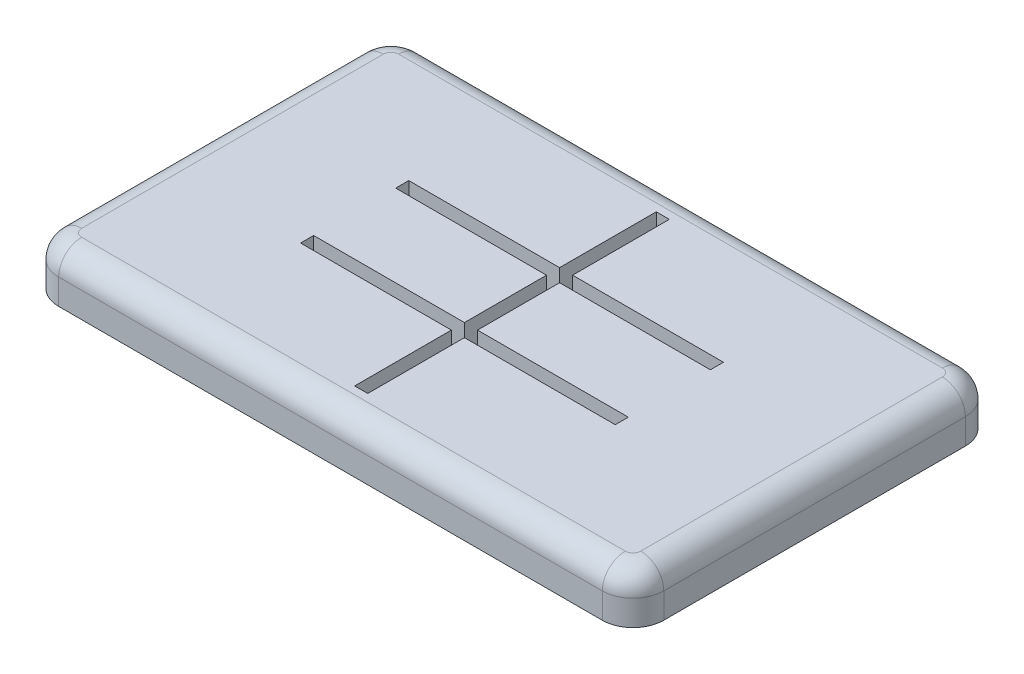
ISO-10303-21;
HEADER;
FILE_DESCRIPTION(('STEP AP214'),'2;1');
FILE_NAME('part.step','',(''),(''),'','','');
FILE_SCHEMA(('AUTOMOTIVE_DESIGN { 1 0 10303 214 1 1 1 1 }'));
ENDSEC;
DATA;
#1=APPLICATION_CONTEXT('core data for automotive mechanical design processes');
#2=APPLICATION_PROTOCOL_DEFINITION('international standard','automotive_design',2000,#1);
#3=PRODUCT_CONTEXT('',#1,'mechanical');
#4=PRODUCT('Part','Part','',(#3));
#5=PRODUCT_RELATED_PRODUCT_CATEGORY('part','',(#4));
#6=PRODUCT_DEFINITION_FORMATION('','',#4);
#7=PRODUCT_DEFINITION_CONTEXT('part definition',#1,'design');
#8=PRODUCT_DEFINITION('design','',#6,#7);
#9=PRODUCT_DEFINITION_SHAPE('','',#8);
#10=(LENGTH_UNIT() NAMED_UNIT(*) SI_UNIT(.MILLI.,.METRE.));
#11=(NAMED_UNIT(*) PLANE_ANGLE_UNIT() SI_UNIT($,.RADIAN.));
#12=(NAMED_UNIT(*) SI_UNIT($,.STERADIAN.) SOLID_ANGLE_UNIT());
#13=UNCERTAINTY_MEASURE_WITH_UNIT(LENGTH_MEASURE(1.E-05),#10,'distance_accuracy_value','');
#14=(GEOMETRIC_REPRESENTATION_CONTEXT(3) GLOBAL_UNCERTAINTY_ASSIGNED_CONTEXT((#13)) GLOBAL_UNIT_ASSIGNED_CONTEXT((#10,
#11,#12)) REPRESENTATION_CONTEXT('',''));
#15=CARTESIAN_POINT('',(0.,0.,0.));
#16=DIRECTION('',(0.,0.,1.));
#17=DIRECTION('',(1.,0.,0.));
#18=AXIS2_PLACEMENT_3D('',#15,#16,#17);
#19=CARTESIAN_POINT('',(0.,-20.,0.));
#20=DIRECTION('',(0.,1.,0.));
#21=DIRECTION('',(0.,0.,1.));
#22=AXIS2_PLACEMENT_3D('',#19,#20,#21);
#23=PLANE('',#22);
#24=DIRECTION('',(0.,0.,1.));
#25=VECTOR('',#24,1.);
#26=CARTESIAN_POINT('',(-125.,-20.,-75.));
#27=LINE('',#26,#25);
#28=CARTESIAN_POINT('',(-125.,-20.,-62.3));
#29=VERTEX_POINT('',#28);
#30=CARTESIAN_POINT('',(-125.,-20.,62.3));
#31=VERTEX_POINT('',#30);
#32=EDGE_CURVE('E396',#29,#31,#27,.T.);
#33=ORIENTED_EDGE('',*,*,#32,.F.);
#34=CARTESIAN_POINT('',(-112.3,-20.,-62.3));
#35=DIRECTION('',(0.,1.,0.));
#36=DIRECTION('',(0.,0.,1.));
#37=AXIS2_PLACEMENT_3D('',#34,#35,#36);
#38=CIRCLE('',#37,12.7);
#39=CARTESIAN_POINT('',(-112.3,-20.,-75.));
#40=VERTEX_POINT('',#39);
#41=EDGE_CURVE('E418',#29,#40,#38,.F.);
#42=ORIENTED_EDGE('',*,*,#41,.T.);
#43=DIRECTION('',(-1.,0.,0.));
#44=VECTOR('',#43,1.);
#45=CARTESIAN_POINT('',(-125.,-20.,-75.));
#46=LINE('',#45,#44);
#47=CARTESIAN_POINT('',(112.3,-20.,-75.));
#48=VERTEX_POINT('',#47);
#49=EDGE_CURVE('E392',#48,#40,#46,.T.);
#50=ORIENTED_EDGE('',*,*,#49,.F.);
#51=CARTESIAN_POINT('',(112.3,-20.,-62.3));
#52=DIRECTION('',(0.,1.,0.));
#53=DIRECTION('',(0.,0.,1.));
#54=AXIS2_PLACEMENT_3D('',#51,#52,#53);
#55=CIRCLE('',#54,12.7);
#56=CARTESIAN_POINT('',(125.,-20.,-62.3));
#57=VERTEX_POINT('',#56);
#58=EDGE_CURVE('E416',#48,#57,#55,.F.);
#59=ORIENTED_EDGE('',*,*,#58,.T.);
#60=DIRECTION('',(0.,0.,-1.));
#61=VECTOR('',#60,1.);
#62=CARTESIAN_POINT('',(125.,-20.,-75.));
#63=LINE('',#62,#61);
#64=CARTESIAN_POINT('',(125.,-20.,62.3));
#65=VERTEX_POINT('',#64);
#66=EDGE_CURVE('E389',#65,#57,#63,.T.);
#67=ORIENTED_EDGE('',*,*,#66,.F.);
#68=CARTESIAN_POINT('',(112.3,-20.,62.3));
#69=DIRECTION('',(0.,1.,0.));
#70=DIRECTION('',(0.,0.,1.));
#71=AXIS2_PLACEMENT_3D('',#68,#69,#70);
#72=CIRCLE('',#71,12.7);
#73=CARTESIAN_POINT('',(112.3,-20.,75.));
#74=VERTEX_POINT('',#73);
#75=EDGE_CURVE('E412',#65,#74,#72,.F.);
#76=ORIENTED_EDGE('',*,*,#75,.T.);
#77=DIRECTION('',(1.,0.,0.));
#78=VECTOR('',#77,1.);
#79=CARTESIAN_POINT('',(-125.,-20.,75.));
#80=LINE('',#79,#78);
#81=CARTESIAN_POINT('',(-112.3,-20.,75.));
#82=VERTEX_POINT('',#81);
#83=EDGE_CURVE('E399',#82,#74,#80,.T.);
#84=ORIENTED_EDGE('',*,*,#83,.F.);
#85=CARTESIAN_POINT('',(-112.3,-20.,62.3));
#86=DIRECTION('',(0.,1.,0.));
#87=DIRECTION('',(0.,0.,1.));
#88=AXIS2_PLACEMENT_3D('',#85,#86,#87);
#89=CIRCLE('',#88,12.7);
#90=EDGE_CURVE('E414',#82,#31,#89,.F.);
#91=ORIENTED_EDGE('',*,*,#90,.T.);
#92=EDGE_LOOP('',(#33,#42,#50,#59,#67,#76,#84,#91));
#93=FACE_BOUND('',#92,.T.);
#94=DIRECTION('',(1.,0.,0.));
#95=VECTOR('',#94,1.);
#96=CARTESIAN_POINT('',(-65.0000000000001,-20.,16.95));
#97=LINE('',#96,#95);
#98=CARTESIAN_POINT('',(-65.0000000000001,-20.,16.95));
#99=VERTEX_POINT('',#98);
#100=CARTESIAN_POINT('',(-2.7,-20.,16.9499999999999));
#101=VERTEX_POINT('',#100);
#102=EDGE_CURVE('E298',#99,#101,#97,.T.);
#103=ORIENTED_EDGE('',*,*,#102,.F.);
#104=DIRECTION('',(0.,0.,1.));
#105=VECTOR('',#104,1.);
#106=CARTESIAN_POINT('',(-65.0000000000001,-20.,16.95));
#107=LINE('',#106,#105);
#108=CARTESIAN_POINT('',(-65.0000000000001,-20.,22.35));
#109=VERTEX_POINT('',#108);
#110=EDGE_CURVE('E320',#99,#109,#107,.T.);
#111=ORIENTED_EDGE('',*,*,#110,.T.);
#112=DIRECTION('',(1.,0.,0.));
#113=VECTOR('',#112,1.);
#114=CARTESIAN_POINT('',(-65.0000000000001,-20.,22.35));
#115=LINE('',#114,#113);
#116=CARTESIAN_POINT('',(-2.7,-20.,22.35));
#117=VERTEX_POINT('',#116);
#118=EDGE_CURVE('E309',#109,#117,#115,.T.);
#119=ORIENTED_EDGE('',*,*,#118,.T.);
#120=DIRECTION('',(0.,0.,1.));
#121=VECTOR('',#120,1.);
#122=CARTESIAN_POINT('',(-2.7,-20.,-62.3));
#123=LINE('',#122,#121);
#124=CARTESIAN_POINT('',(-2.7,-20.,61.3000000000001));
#125=VERTEX_POINT('',#124);
#126=EDGE_CURVE('E328',#117,#125,#123,.T.);
#127=ORIENTED_EDGE('',*,*,#126,.T.);
#128=DIRECTION('',(1.,0.,0.));
#129=VECTOR('',#128,1.);
#130=CARTESIAN_POINT('',(-2.7,-20.,61.3000000000001));
#131=LINE('',#130,#129);
#132=CARTESIAN_POINT('',(2.7,-20.,61.3000000000001));
#133=VERTEX_POINT('',#132);
#134=EDGE_CURVE('E369',#133,#125,#131,.F.);
#135=ORIENTED_EDGE('',*,*,#134,.F.);
#136=DIRECTION('',(0.,0.,1.));
#137=VECTOR('',#136,1.);
#138=CARTESIAN_POINT('',(2.7,-20.,-62.3));
#139=LINE('',#138,#137);
#140=CARTESIAN_POINT('',(2.7,-20.,22.35));
#141=VERTEX_POINT('',#140);
#142=EDGE_CURVE('E351',#141,#133,#139,.T.);
#143=ORIENTED_EDGE('',*,*,#142,.F.);
#144=CARTESIAN_POINT('',(65.0000000000001,-20.,22.35));
#145=VERTEX_POINT('',#144);
#146=EDGE_CURVE('E308',#141,#145,#115,.T.);
#147=ORIENTED_EDGE('',*,*,#146,.T.);
#148=DIRECTION('',(0.,0.,1.));
#149=VECTOR('',#148,1.);
#150=CARTESIAN_POINT('',(65.0000000000001,-20.,16.95));
#151=LINE('',#150,#149);
#152=CARTESIAN_POINT('',(65.0000000000001,-20.,16.95));
#153=VERTEX_POINT('',#152);
#154=EDGE_CURVE('E318',#153,#145,#151,.T.);
#155=ORIENTED_EDGE('',*,*,#154,.F.);
#156=CARTESIAN_POINT('',(2.7,-20.,16.9499999999999));
#157=VERTEX_POINT('',#156);
#158=EDGE_CURVE('E296',#157,#153,#97,.T.);
#159=ORIENTED_EDGE('',*,*,#158,.F.);
#160=CARTESIAN_POINT('',(2.7,-20.,-16.95));
#161=VERTEX_POINT('',#160);
#162=EDGE_CURVE('E356',#161,#157,#139,.T.);
#163=ORIENTED_EDGE('',*,*,#162,.F.);
#164=DIRECTION('',(1.,0.,0.));
#165=VECTOR('',#164,1.);
#166=CARTESIAN_POINT('',(-65.0000000000001,-20.,-16.95));
#167=LINE('',#166,#165);
#168=CARTESIAN_POINT('',(65.0000000000001,-20.,-16.95));
#169=VERTEX_POINT('',#168);
#170=EDGE_CURVE('E942',#161,#169,#167,.T.);
#171=ORIENTED_EDGE('',*,*,#170,.T.);
#172=DIRECTION('',(0.,0.,1.));
#173=VECTOR('',#172,1.);
#174=CARTESIAN_POINT('',(65.0000000000001,-20.,-22.35));
#175=LINE('',#174,#173);
#176=CARTESIAN_POINT('',(65.0000000000001,-20.,-22.35));
#177=VERTEX_POINT('',#176);
#178=EDGE_CURVE('E286',#177,#169,#175,.T.);
#179=ORIENTED_EDGE('',*,*,#178,.F.);
#180=DIRECTION('',(1.,0.,0.));
#181=VECTOR('',#180,1.);
#182=CARTESIAN_POINT('',(-65.0000000000001,-20.,-22.35));
#183=LINE('',#182,#181);
#184=CARTESIAN_POINT('',(2.7,-20.,-22.35));
#185=VERTEX_POINT('',#184);
#186=EDGE_CURVE('E276',#185,#177,#183,.T.);
#187=ORIENTED_EDGE('',*,*,#186,.F.);
#188=CARTESIAN_POINT('',(2.7,-20.,-61.3));
#189=VERTEX_POINT('',#188);
#190=EDGE_CURVE('E352',#189,#185,#139,.T.);
#191=ORIENTED_EDGE('',*,*,#190,.F.);
#192=DIRECTION('',(1.,0.,0.));
#193=VECTOR('',#192,1.);
#194=CARTESIAN_POINT('',(-2.7,-20.,-61.3));
#195=LINE('',#194,#193);
#196=CARTESIAN_POINT('',(-2.7,-20.,-61.3));
#197=VERTEX_POINT('',#196);
#198=EDGE_CURVE('E371',#197,#189,#195,.T.);
#199=ORIENTED_EDGE('',*,*,#198,.F.);
#200=CARTESIAN_POINT('',(-2.7,-20.,-22.35));
#201=VERTEX_POINT('',#200);
#202=EDGE_CURVE('E329',#197,#201,#123,.T.);
#203=ORIENTED_EDGE('',*,*,#202,.T.);
#204=CARTESIAN_POINT('',(-65.0000000000001,-20.,-22.35));
#205=VERTEX_POINT('',#204);
#206=EDGE_CURVE('E289',#205,#201,#183,.T.);
#207=ORIENTED_EDGE('',*,*,#206,.F.);
#208=DIRECTION('',(0.,0.,1.));
#209=VECTOR('',#208,1.);
#210=CARTESIAN_POINT('',(-65.0000000000001,-20.,-22.35));
#211=LINE('',#210,#209);
#212=CARTESIAN_POINT('',(-65.0000000000001,-20.,-16.95));
#213=VERTEX_POINT('',#212);
#214=EDGE_CURVE('E275',#205,#213,#211,.T.);
#215=ORIENTED_EDGE('',*,*,#214,.T.);
#216=CARTESIAN_POINT('',(-2.7,-20.,-16.95));
#217=VERTEX_POINT('',#216);
#218=EDGE_CURVE('E528',#213,#217,#167,.T.);
#219=ORIENTED_EDGE('',*,*,#218,.T.);
#220=EDGE_CURVE('E333',#217,#101,#123,.T.);
#221=ORIENTED_EDGE('',*,*,#220,.T.);
#222=EDGE_LOOP('',(#103,#111,#119,#127,#135,#143,#147,#155,#159,#163,#171,#179,#187,#191,#199,
#203,#207,#215,#219,#221));
#223=FACE_BOUND('',#222,.T.);
#224=ADVANCED_FACE('F35',(#93,#223),#23,.F.);
#225=CARTESIAN_POINT('',(125.,-20.,-75.));
#226=DIRECTION('',(1.,0.,0.));
#227=DIRECTION('',(0.,0.,-1.));
#228=AXIS2_PLACEMENT_3D('',#225,#226,#227);
#229=PLANE('',#228);
#230=DIRECTION('',(0.,1.,0.));
#231=VECTOR('',#230,1.);
#232=CARTESIAN_POINT('',(125.,-20.,-62.3));
#233=LINE('',#232,#231);
#234=CARTESIAN_POINT('',(125.,-9.5,-62.3));
#235=VERTEX_POINT('',#234);
#236=EDGE_CURVE('E422',#57,#235,#233,.T.);
#237=ORIENTED_EDGE('',*,*,#236,.T.);
#238=DIRECTION('',(0.,0.,-1.));
#239=VECTOR('',#238,1.);
#240=CARTESIAN_POINT('',(125.,-9.5,-75.));
#241=LINE('',#240,#239);
#242=CARTESIAN_POINT('',(125.,-9.5,62.3));
#243=VERTEX_POINT('',#242);
#244=EDGE_CURVE('E458',#235,#243,#241,.F.);
#245=ORIENTED_EDGE('',*,*,#244,.T.);
#246=DIRECTION('',(0.,1.,0.));
#247=VECTOR('',#246,1.);
#248=CARTESIAN_POINT('',(125.,-20.,62.3));
#249=LINE('',#248,#247);
#250=EDGE_CURVE('E420',#243,#65,#249,.F.);
#251=ORIENTED_EDGE('',*,*,#250,.T.);
#252=ORIENTED_EDGE('',*,*,#66,.T.);
#253=EDGE_LOOP('',(#237,#245,#251,#252));
#254=FACE_BOUND('',#253,.T.);
#255=ADVANCED_FACE('F554',(#254),#229,.T.);
#256=CARTESIAN_POINT('',(-125.,-20.,75.));
#257=DIRECTION('',(0.,0.,1.));
#258=DIRECTION('',(1.,0.,0.));
#259=AXIS2_PLACEMENT_3D('',#256,#257,#258);
#260=PLANE('',#259);
#261=DIRECTION('',(0.,1.,0.));
#262=VECTOR('',#261,1.);
#263=CARTESIAN_POINT('',(112.3,-20.,75.));
#264=LINE('',#263,#262);
#265=CARTESIAN_POINT('',(112.3,-9.5,75.));
#266=VERTEX_POINT('',#265);
#267=EDGE_CURVE('E425',#74,#266,#264,.T.);
#268=ORIENTED_EDGE('',*,*,#267,.T.);
#269=DIRECTION('',(1.,0.,0.));
#270=VECTOR('',#269,1.);
#271=CARTESIAN_POINT('',(-125.,-9.5,75.));
#272=LINE('',#271,#270);
#273=CARTESIAN_POINT('',(-112.3,-9.5,75.));
#274=VERTEX_POINT('',#273);
#275=EDGE_CURVE('E462',#266,#274,#272,.F.);
#276=ORIENTED_EDGE('',*,*,#275,.T.);
#277=DIRECTION('',(0.,1.,0.));
#278=VECTOR('',#277,1.);
#279=CARTESIAN_POINT('',(-112.3,-20.,75.));
#280=LINE('',#279,#278);
#281=EDGE_CURVE('E428',#274,#82,#280,.F.);
#282=ORIENTED_EDGE('',*,*,#281,.T.);
#283=ORIENTED_EDGE('',*,*,#83,.T.);
#284=EDGE_LOOP('',(#268,#276,#282,#283));
#285=FACE_BOUND('',#284,.T.);
#286=ADVANCED_FACE('F560',(#285),#260,.T.);
#287=CARTESIAN_POINT('',(-125.,-20.,-75.));
#288=DIRECTION('',(-1.,0.,0.));
#289=DIRECTION('',(0.,0.,1.));
#290=AXIS2_PLACEMENT_3D('',#287,#288,#289);
#291=PLANE('',#290);
#292=DIRECTION('',(0.,1.,0.));
#293=VECTOR('',#292,1.);
#294=CARTESIAN_POINT('',(-125.,-20.,62.3));
#295=LINE('',#294,#293);
#296=CARTESIAN_POINT('',(-125.,-9.5,62.3));
#297=VERTEX_POINT('',#296);
#298=EDGE_CURVE('E407',#31,#297,#295,.T.);
#299=ORIENTED_EDGE('',*,*,#298,.T.);
#300=DIRECTION('',(0.,0.,1.));
#301=VECTOR('',#300,1.);
#302=CARTESIAN_POINT('',(-125.,-9.5,-75.));
#303=LINE('',#302,#301);
#304=CARTESIAN_POINT('',(-125.,-9.5,-62.3));
#305=VERTEX_POINT('',#304);
#306=EDGE_CURVE('E450',#297,#305,#303,.F.);
#307=ORIENTED_EDGE('',*,*,#306,.T.);
#308=DIRECTION('',(0.,1.,0.));
#309=VECTOR('',#308,1.);
#310=CARTESIAN_POINT('',(-125.,-20.,-62.3));
#311=LINE('',#310,#309);
#312=EDGE_CURVE('E410',#305,#29,#311,.F.);
#313=ORIENTED_EDGE('',*,*,#312,.T.);
#314=ORIENTED_EDGE('',*,*,#32,.T.);
#315=EDGE_LOOP('',(#299,#307,#313,#314));
#316=FACE_BOUND('',#315,.T.);
#317=ADVANCED_FACE('F573',(#316),#291,.T.);
#318=CARTESIAN_POINT('',(-125.,-20.,-75.));
#319=DIRECTION('',(0.,0.,-1.));
#320=DIRECTION('',(-1.,0.,0.));
#321=AXIS2_PLACEMENT_3D('',#318,#319,#320);
#322=PLANE('',#321);
#323=DIRECTION('',(0.,1.,0.));
#324=VECTOR('',#323,1.);
#325=CARTESIAN_POINT('',(-112.3,-20.,-75.));
#326=LINE('',#325,#324);
#327=CARTESIAN_POINT('',(-112.3,-9.5,-75.));
#328=VERTEX_POINT('',#327);
#329=EDGE_CURVE('E404',#40,#328,#326,.T.);
#330=ORIENTED_EDGE('',*,*,#329,.T.);
#331=DIRECTION('',(-1.,0.,0.));
#332=VECTOR('',#331,1.);
#333=CARTESIAN_POINT('',(-125.,-9.5,-75.));
#334=LINE('',#333,#332);
#335=CARTESIAN_POINT('',(112.3,-9.5,-75.));
#336=VERTEX_POINT('',#335);
#337=EDGE_CURVE('E454',#328,#336,#334,.F.);
#338=ORIENTED_EDGE('',*,*,#337,.T.);
#339=DIRECTION('',(0.,1.,0.));
#340=VECTOR('',#339,1.);
#341=CARTESIAN_POINT('',(112.3,-20.,-75.));
#342=LINE('',#341,#340);
#343=EDGE_CURVE('E402',#336,#48,#342,.F.);
#344=ORIENTED_EDGE('',*,*,#343,.T.);
#345=ORIENTED_EDGE('',*,*,#49,.T.);
#346=EDGE_LOOP('',(#330,#338,#344,#345));
#347=FACE_BOUND('',#346,.T.);
#348=ADVANCED_FACE('F570',(#347),#322,.T.);
#349=CARTESIAN_POINT('',(0.,0.,0.));
#350=DIRECTION('',(0.,1.,0.));
#351=DIRECTION('',(0.,0.,1.));
#352=AXIS2_PLACEMENT_3D('',#349,#350,#351);
#353=PLANE('',#352);
#354=DIRECTION('',(0.,0.,1.));
#355=VECTOR('',#354,1.);
#356=CARTESIAN_POINT('',(-2.7,0.,0.));
#357=LINE('',#356,#355);
#358=CARTESIAN_POINT('',(-2.7,1.11022302462516E-13,22.35));
#359=VERTEX_POINT('',#358);
#360=CARTESIAN_POINT('',(-2.7,0.,62.3000000000001));
#361=VERTEX_POINT('',#360);
#362=EDGE_CURVE('E11',#359,#361,#357,.T.);
#363=ORIENTED_EDGE('',*,*,#362,.F.);
#364=DIRECTION('',(1.,0.,0.));
#365=VECTOR('',#364,1.);
#366=CARTESIAN_POINT('',(0.,0.,22.35));
#367=LINE('',#366,#365);
#368=CARTESIAN_POINT('',(-65.0000000000001,0.,22.35));
#369=VERTEX_POINT('',#368);
#370=EDGE_CURVE('E43',#369,#359,#367,.T.);
#371=ORIENTED_EDGE('',*,*,#370,.F.);
#372=DIRECTION('',(0.,0.,1.));
#373=VECTOR('',#372,1.);
#374=CARTESIAN_POINT('',(-65.0000000000001,0.,16.95));
#375=LINE('',#374,#373);
#376=CARTESIAN_POINT('',(-65.0000000000001,0.,16.95));
#377=VERTEX_POINT('',#376);
#378=EDGE_CURVE('E304',#377,#369,#375,.T.);
#379=ORIENTED_EDGE('',*,*,#378,.F.);
#380=DIRECTION('',(1.,0.,0.));
#381=VECTOR('',#380,1.);
#382=CARTESIAN_POINT('',(0.,0.,16.95));
#383=LINE('',#382,#381);
#384=CARTESIAN_POINT('',(-2.7,0.,16.95));
#385=VERTEX_POINT('',#384);
#386=EDGE_CURVE('E492',#377,#385,#383,.T.);
#387=ORIENTED_EDGE('',*,*,#386,.T.);
#388=DIRECTION('',(0.,0.,1.));
#389=VECTOR('',#388,1.);
#390=CARTESIAN_POINT('',(-2.7,0.,0.));
#391=LINE('',#390,#389);
#392=CARTESIAN_POINT('',(-2.7,0.,-16.9499999999999));
#393=VERTEX_POINT('',#392);
#394=EDGE_CURVE('E493',#393,#385,#391,.T.);
#395=ORIENTED_EDGE('',*,*,#394,.F.);
#396=DIRECTION('',(1.,0.,0.));
#397=VECTOR('',#396,1.);
#398=CARTESIAN_POINT('',(0.,0.,-16.95));
#399=LINE('',#398,#397);
#400=CARTESIAN_POINT('',(-65.0000000000001,0.,-16.95));
#401=VERTEX_POINT('',#400);
#402=EDGE_CURVE('E283',#401,#393,#399,.T.);
#403=ORIENTED_EDGE('',*,*,#402,.F.);
#404=DIRECTION('',(0.,0.,1.));
#405=VECTOR('',#404,1.);
#406=CARTESIAN_POINT('',(-65.0000000000001,0.,-22.35));
#407=LINE('',#406,#405);
#408=CARTESIAN_POINT('',(-65.0000000000001,0.,-22.35));
#409=VERTEX_POINT('',#408);
#410=EDGE_CURVE('E272',#409,#401,#407,.T.);
#411=ORIENTED_EDGE('',*,*,#410,.F.);
#412=DIRECTION('',(1.,0.,0.));
#413=VECTOR('',#412,1.);
#414=CARTESIAN_POINT('',(0.,0.,-22.35));
#415=LINE('',#414,#413);
#416=CARTESIAN_POINT('',(-2.7,1.11022302462516E-13,-22.3499999999999));
#417=VERTEX_POINT('',#416);
#418=EDGE_CURVE('E255',#409,#417,#415,.T.);
#419=ORIENTED_EDGE('',*,*,#418,.T.);
#420=DIRECTION('',(0.,0.,1.));
#421=VECTOR('',#420,1.);
#422=CARTESIAN_POINT('',(-2.7,0.,0.));
#423=LINE('',#422,#421);
#424=CARTESIAN_POINT('',(-2.7,0.,-62.3));
#425=VERTEX_POINT('',#424);
#426=EDGE_CURVE('E265',#425,#417,#423,.T.);
#427=ORIENTED_EDGE('',*,*,#426,.F.);
#428=DIRECTION('',(1.,0.,0.));
#429=VECTOR('',#428,1.);
#430=CARTESIAN_POINT('',(-2.7,0.,-62.3));
#431=LINE('',#430,#429);
#432=CARTESIAN_POINT('',(2.7,0.,-62.3));
#433=VERTEX_POINT('',#432);
#434=EDGE_CURVE('E366',#425,#433,#431,.T.);
#435=ORIENTED_EDGE('',*,*,#434,.T.);
#436=DIRECTION('',(0.,0.,1.));
#437=VECTOR('',#436,1.);
#438=CARTESIAN_POINT('',(2.7,0.,0.));
#439=LINE('',#438,#437);
#440=CARTESIAN_POINT('',(2.7,1.11022302462516E-13,-22.3499999999999));
#441=VERTEX_POINT('',#440);
#442=EDGE_CURVE('E266',#433,#441,#439,.T.);
#443=ORIENTED_EDGE('',*,*,#442,.T.);
#444=CARTESIAN_POINT('',(65.0000000000001,0.,-22.35));
#445=VERTEX_POINT('',#444);
#446=EDGE_CURVE('E268',#441,#445,#415,.T.);
#447=ORIENTED_EDGE('',*,*,#446,.T.);
#448=DIRECTION('',(0.,0.,1.));
#449=VECTOR('',#448,1.);
#450=CARTESIAN_POINT('',(65.0000000000001,0.,-22.35));
#451=LINE('',#450,#449);
#452=CARTESIAN_POINT('',(65.0000000000001,0.,-16.95));
#453=VERTEX_POINT('',#452);
#454=EDGE_CURVE('E348',#445,#453,#451,.T.);
#455=ORIENTED_EDGE('',*,*,#454,.T.);
#456=CARTESIAN_POINT('',(2.7,0.,-16.95));
#457=VERTEX_POINT('',#456);
#458=EDGE_CURVE('E464',#457,#453,#399,.T.);
#459=ORIENTED_EDGE('',*,*,#458,.F.);
#460=DIRECTION('',(0.,0.,1.));
#461=VECTOR('',#460,1.);
#462=CARTESIAN_POINT('',(2.7,0.,0.));
#463=LINE('',#462,#461);
#464=CARTESIAN_POINT('',(2.7,0.,16.95));
#465=VERTEX_POINT('',#464);
#466=EDGE_CURVE('E486',#457,#465,#463,.T.);
#467=ORIENTED_EDGE('',*,*,#466,.T.);
#468=CARTESIAN_POINT('',(65.0000000000001,0.,16.95));
#469=VERTEX_POINT('',#468);
#470=EDGE_CURVE('E489',#465,#469,#383,.T.);
#471=ORIENTED_EDGE('',*,*,#470,.T.);
#472=DIRECTION('',(0.,0.,1.));
#473=VECTOR('',#472,1.);
#474=CARTESIAN_POINT('',(65.0000000000001,0.,16.95));
#475=LINE('',#474,#473);
#476=CARTESIAN_POINT('',(65.0000000000001,0.,22.35));
#477=VERTEX_POINT('',#476);
#478=EDGE_CURVE('E314',#469,#477,#475,.T.);
#479=ORIENTED_EDGE('',*,*,#478,.T.);
#480=CARTESIAN_POINT('',(2.7,1.11022302462516E-13,22.35));
#481=VERTEX_POINT('',#480);
#482=EDGE_CURVE('E499',#481,#477,#367,.T.);
#483=ORIENTED_EDGE('',*,*,#482,.F.);
#484=DIRECTION('',(0.,0.,1.));
#485=VECTOR('',#484,1.);
#486=CARTESIAN_POINT('',(2.7,0.,0.));
#487=LINE('',#486,#485);
#488=CARTESIAN_POINT('',(2.7,0.,62.3000000000001));
#489=VERTEX_POINT('',#488);
#490=EDGE_CURVE('E500',#481,#489,#487,.T.);
#491=ORIENTED_EDGE('',*,*,#490,.T.);
#492=DIRECTION('',(1.,0.,0.));
#493=VECTOR('',#492,1.);
#494=CARTESIAN_POINT('',(-2.7,0.,62.3000000000001));
#495=LINE('',#494,#493);
#496=EDGE_CURVE('E343',#361,#489,#495,.T.);
#497=ORIENTED_EDGE('',*,*,#496,.F.);
#498=EDGE_LOOP('',(#363,#371,#379,#387,#395,#403,#411,#419,#427,#435,#443,#447,#455,#459,#467,
#471,#479,#483,#491,#497));
#499=FACE_BOUND('',#498,.T.);
#500=DIRECTION('',(0.,0.,1.));
#501=VECTOR('',#500,1.);
#502=CARTESIAN_POINT('',(-115.5,0.,0.));
#503=LINE('',#502,#501);
#504=CARTESIAN_POINT('',(-115.5,0.,-62.3));
#505=VERTEX_POINT('',#504);
#506=CARTESIAN_POINT('',(-115.5,0.,62.3));
#507=VERTEX_POINT('',#506);
#508=EDGE_CURVE('E442',#505,#507,#503,.T.);
#509=ORIENTED_EDGE('',*,*,#508,.T.);
#510=CARTESIAN_POINT('',(-112.3,0.,62.3));
#511=DIRECTION('',(0.,1.,0.));
#512=DIRECTION('',(0.,0.,1.));
#513=AXIS2_PLACEMENT_3D('',#510,#511,#512);
#514=CIRCLE('',#513,3.2);
#515=CARTESIAN_POINT('',(-112.3,0.,65.5));
#516=VERTEX_POINT('',#515);
#517=EDGE_CURVE('E444',#507,#516,#514,.T.);
#518=ORIENTED_EDGE('',*,*,#517,.T.);
#519=DIRECTION('',(1.,0.,0.));
#520=VECTOR('',#519,1.);
#521=CARTESIAN_POINT('',(0.,0.,65.5));
#522=LINE('',#521,#520);
#523=CARTESIAN_POINT('',(112.3,0.,65.5));
#524=VERTEX_POINT('',#523);
#525=EDGE_CURVE('E430',#516,#524,#522,.T.);
#526=ORIENTED_EDGE('',*,*,#525,.T.);
#527=CARTESIAN_POINT('',(112.3,0.,62.3));
#528=DIRECTION('',(0.,1.,0.));
#529=DIRECTION('',(0.,0.,1.));
#530=AXIS2_PLACEMENT_3D('',#527,#528,#529);
#531=CIRCLE('',#530,3.2);
#532=CARTESIAN_POINT('',(115.5,0.,62.3));
#533=VERTEX_POINT('',#532);
#534=EDGE_CURVE('E432',#524,#533,#531,.T.);
#535=ORIENTED_EDGE('',*,*,#534,.T.);
#536=DIRECTION('',(0.,0.,-1.));
#537=VECTOR('',#536,1.);
#538=CARTESIAN_POINT('',(115.5,0.,0.));
#539=LINE('',#538,#537);
#540=CARTESIAN_POINT('',(115.5,0.,-62.3));
#541=VERTEX_POINT('',#540);
#542=EDGE_CURVE('E434',#533,#541,#539,.T.);
#543=ORIENTED_EDGE('',*,*,#542,.T.);
#544=CARTESIAN_POINT('',(112.3,0.,-62.3));
#545=DIRECTION('',(0.,1.,0.));
#546=DIRECTION('',(0.,0.,1.));
#547=AXIS2_PLACEMENT_3D('',#544,#545,#546);
#548=CIRCLE('',#547,3.2);
#549=CARTESIAN_POINT('',(112.3,0.,-65.5));
#550=VERTEX_POINT('',#549);
#551=EDGE_CURVE('E436',#541,#550,#548,.T.);
#552=ORIENTED_EDGE('',*,*,#551,.T.);
#553=DIRECTION('',(-1.,0.,0.));
#554=VECTOR('',#553,1.);
#555=CARTESIAN_POINT('',(0.,0.,-65.5));
#556=LINE('',#555,#554);
#557=CARTESIAN_POINT('',(-112.3,0.,-65.5));
#558=VERTEX_POINT('',#557);
#559=EDGE_CURVE('E438',#550,#558,#556,.T.);
#560=ORIENTED_EDGE('',*,*,#559,.T.);
#561=CARTESIAN_POINT('',(-112.3,0.,-62.3));
#562=DIRECTION('',(0.,1.,0.));
#563=DIRECTION('',(0.,0.,1.));
#564=AXIS2_PLACEMENT_3D('',#561,#562,#563);
#565=CIRCLE('',#564,3.2);
#566=EDGE_CURVE('E440',#558,#505,#565,.T.);
#567=ORIENTED_EDGE('',*,*,#566,.T.);
#568=EDGE_LOOP('',(#509,#518,#526,#535,#543,#552,#560,#567));
#569=FACE_BOUND('',#568,.T.);
#570=ADVANCED_FACE('F280',(#499,#569),#353,.T.);
#571=CARTESIAN_POINT('',(-112.3,-20.,-62.3));
#572=DIRECTION('',(0.,1.,0.));
#573=DIRECTION('',(0.,0.,1.));
#574=AXIS2_PLACEMENT_3D('',#571,#572,#573);
#575=CYLINDRICAL_SURFACE('',#574,12.7);
#576=ORIENTED_EDGE('',*,*,#312,.F.);
#577=CARTESIAN_POINT('',(-112.3,-9.5,-62.3));
#578=DIRECTION('',(0.,1.,0.));
#579=DIRECTION('',(0.,0.,1.));
#580=AXIS2_PLACEMENT_3D('',#577,#578,#579);
#581=CIRCLE('',#580,12.7);
#582=EDGE_CURVE('E452',#305,#328,#581,.F.);
#583=ORIENTED_EDGE('',*,*,#582,.T.);
#584=ORIENTED_EDGE('',*,*,#329,.F.);
#585=ORIENTED_EDGE('',*,*,#41,.F.);
#586=EDGE_LOOP('',(#576,#583,#584,#585));
#587=FACE_BOUND('',#586,.T.);
#588=ADVANCED_FACE('F569',(#587),#575,.T.);
#589=CARTESIAN_POINT('',(112.3,-20.,-62.3));
#590=DIRECTION('',(0.,1.,0.));
#591=DIRECTION('',(0.,0.,1.));
#592=AXIS2_PLACEMENT_3D('',#589,#590,#591);
#593=CYLINDRICAL_SURFACE('',#592,12.7);
#594=ORIENTED_EDGE('',*,*,#343,.F.);
#595=CARTESIAN_POINT('',(112.3,-9.5,-62.3));
#596=DIRECTION('',(0.,1.,0.));
#597=DIRECTION('',(0.,0.,1.));
#598=AXIS2_PLACEMENT_3D('',#595,#596,#597);
#599=CIRCLE('',#598,12.7);
#600=EDGE_CURVE('E456',#336,#235,#599,.F.);
#601=ORIENTED_EDGE('',*,*,#600,.T.);
#602=ORIENTED_EDGE('',*,*,#236,.F.);
#603=ORIENTED_EDGE('',*,*,#58,.F.);
#604=EDGE_LOOP('',(#594,#601,#602,#603));
#605=FACE_BOUND('',#604,.T.);
#606=ADVANCED_FACE('F583',(#605),#593,.T.);
#607=CARTESIAN_POINT('',(-112.3,-20.,62.3));
#608=DIRECTION('',(0.,1.,0.));
#609=DIRECTION('',(0.,0.,1.));
#610=AXIS2_PLACEMENT_3D('',#607,#608,#609);
#611=CYLINDRICAL_SURFACE('',#610,12.7);
#612=ORIENTED_EDGE('',*,*,#281,.F.);
#613=CARTESIAN_POINT('',(-112.3,-9.5,62.3));
#614=DIRECTION('',(0.,1.,0.));
#615=DIRECTION('',(0.,0.,1.));
#616=AXIS2_PLACEMENT_3D('',#613,#614,#615);
#617=CIRCLE('',#616,12.7);
#618=EDGE_CURVE('E447',#274,#297,#617,.F.);
#619=ORIENTED_EDGE('',*,*,#618,.T.);
#620=ORIENTED_EDGE('',*,*,#298,.F.);
#621=ORIENTED_EDGE('',*,*,#90,.F.);
#622=EDGE_LOOP('',(#612,#619,#620,#621));
#623=FACE_BOUND('',#622,.T.);
#624=ADVANCED_FACE('F587',(#623),#611,.T.);
#625=CARTESIAN_POINT('',(112.3,-20.,62.3));
#626=DIRECTION('',(0.,1.,0.));
#627=DIRECTION('',(0.,0.,1.));
#628=AXIS2_PLACEMENT_3D('',#625,#626,#627);
#629=CYLINDRICAL_SURFACE('',#628,12.7);
#630=ORIENTED_EDGE('',*,*,#250,.F.);
#631=CARTESIAN_POINT('',(112.3,-9.5,62.3));
#632=DIRECTION('',(0.,1.,0.));
#633=DIRECTION('',(0.,0.,1.));
#634=AXIS2_PLACEMENT_3D('',#631,#632,#633);
#635=CIRCLE('',#634,12.7);
#636=EDGE_CURVE('E460',#243,#266,#635,.F.);
#637=ORIENTED_EDGE('',*,*,#636,.T.);
#638=ORIENTED_EDGE('',*,*,#267,.F.);
#639=ORIENTED_EDGE('',*,*,#75,.F.);
#640=EDGE_LOOP('',(#630,#637,#638,#639));
#641=FACE_BOUND('',#640,.T.);
#642=ADVANCED_FACE('F591',(#641),#629,.T.);
#643=CARTESIAN_POINT('',(112.3,-9.5,-62.3));
#644=DIRECTION('',(0.,1.,0.));
#645=DIRECTION('',(0.,0.,1.));
#646=AXIS2_PLACEMENT_3D('',#643,#644,#645);
#647=DEGENERATE_TOROIDAL_SURFACE('',#646,3.2,9.5,.T.);
#648=CARTESIAN_POINT('',(115.5,-9.5,-62.3));
#649=DIRECTION('',(0.,0.,1.));
#650=DIRECTION('',(1.,0.,0.));
#651=AXIS2_PLACEMENT_3D('',#648,#649,#650);
#652=CIRCLE('',#651,9.5);
#653=EDGE_CURVE('E480',#235,#541,#652,.T.);
#654=ORIENTED_EDGE('',*,*,#653,.F.);
#655=ORIENTED_EDGE('',*,*,#600,.F.);
#656=CARTESIAN_POINT('',(112.3,-9.5,-65.5));
#657=DIRECTION('',(-1.,0.,0.));
#658=DIRECTION('',(0.,0.,1.));
#659=AXIS2_PLACEMENT_3D('',#656,#657,#658);
#660=CIRCLE('',#659,9.5);
#661=EDGE_CURVE('E393',#550,#336,#660,.T.);
#662=ORIENTED_EDGE('',*,*,#661,.F.);
#663=ORIENTED_EDGE('',*,*,#551,.F.);
#664=EDGE_LOOP('',(#654,#655,#662,#663));
#665=FACE_BOUND('',#664,.T.);
#666=ADVANCED_FACE('F37',(#665),#647,.T.);
#667=CARTESIAN_POINT('',(0.,-9.5,-65.5));
#668=DIRECTION('',(-1.,0.,0.));
#669=DIRECTION('',(0.,0.,1.));
#670=AXIS2_PLACEMENT_3D('',#667,#668,#669);
#671=CYLINDRICAL_SURFACE('',#670,9.5);
#672=ORIENTED_EDGE('',*,*,#661,.T.);
#673=ORIENTED_EDGE('',*,*,#337,.F.);
#674=CARTESIAN_POINT('',(-112.3,-9.5,-65.5));
#675=DIRECTION('',(-1.,0.,0.));
#676=DIRECTION('',(0.,0.,1.));
#677=AXIS2_PLACEMENT_3D('',#674,#675,#676);
#678=CIRCLE('',#677,9.5);
#679=EDGE_CURVE('E477',#558,#328,#678,.T.);
#680=ORIENTED_EDGE('',*,*,#679,.F.);
#681=ORIENTED_EDGE('',*,*,#559,.F.);
#682=EDGE_LOOP('',(#672,#673,#680,#681));
#683=FACE_BOUND('',#682,.T.);
#684=ADVANCED_FACE('F618',(#683),#671,.T.);
#685=CARTESIAN_POINT('',(115.5,-9.5,0.));
#686=DIRECTION('',(0.,0.,-1.));
#687=DIRECTION('',(-1.,0.,0.));
#688=AXIS2_PLACEMENT_3D('',#685,#686,#687);
#689=CYLINDRICAL_SURFACE('',#688,9.5);
#690=ORIENTED_EDGE('',*,*,#653,.T.);
#691=ORIENTED_EDGE('',*,*,#542,.F.);
#692=CARTESIAN_POINT('',(115.5,-9.5,62.3));
#693=DIRECTION('',(0.,0.,1.));
#694=DIRECTION('',(1.,0.,0.));
#695=AXIS2_PLACEMENT_3D('',#692,#693,#694);
#696=CIRCLE('',#695,9.5);
#697=EDGE_CURVE('E474',#243,#533,#696,.T.);
#698=ORIENTED_EDGE('',*,*,#697,.F.);
#699=ORIENTED_EDGE('',*,*,#244,.F.);
#700=EDGE_LOOP('',(#690,#691,#698,#699));
#701=FACE_BOUND('',#700,.T.);
#702=ADVANCED_FACE('F615',(#701),#689,.T.);
#703=CARTESIAN_POINT('',(-112.3,-9.5,-62.3));
#704=DIRECTION('',(0.,1.,0.));
#705=DIRECTION('',(0.,0.,1.));
#706=AXIS2_PLACEMENT_3D('',#703,#704,#705);
#707=DEGENERATE_TOROIDAL_SURFACE('',#706,3.2,9.5,.T.);
#708=ORIENTED_EDGE('',*,*,#679,.T.);
#709=ORIENTED_EDGE('',*,*,#582,.F.);
#710=CARTESIAN_POINT('',(-115.5,-9.5,-62.3));
#711=DIRECTION('',(0.,0.,1.));
#712=DIRECTION('',(1.,0.,0.));
#713=AXIS2_PLACEMENT_3D('',#710,#711,#712);
#714=CIRCLE('',#713,9.5);
#715=EDGE_CURVE('E471',#505,#305,#714,.T.);
#716=ORIENTED_EDGE('',*,*,#715,.F.);
#717=ORIENTED_EDGE('',*,*,#566,.F.);
#718=EDGE_LOOP('',(#708,#709,#716,#717));
#719=FACE_BOUND('',#718,.T.);
#720=ADVANCED_FACE('F611',(#719),#707,.T.);
#721=CARTESIAN_POINT('',(112.3,-9.5,62.3));
#722=DIRECTION('',(0.,1.,0.));
#723=DIRECTION('',(0.,0.,1.));
#724=AXIS2_PLACEMENT_3D('',#721,#722,#723);
#725=DEGENERATE_TOROIDAL_SURFACE('',#724,3.2,9.5,.T.);
#726=ORIENTED_EDGE('',*,*,#697,.T.);
#727=ORIENTED_EDGE('',*,*,#534,.F.);
#728=CARTESIAN_POINT('',(112.3,-9.5,65.5));
#729=DIRECTION('',(-1.,0.,0.));
#730=DIRECTION('',(0.,0.,1.));
#731=AXIS2_PLACEMENT_3D('',#728,#729,#730);
#732=CIRCLE('',#731,9.5);
#733=EDGE_CURVE('E468',#266,#524,#732,.T.);
#734=ORIENTED_EDGE('',*,*,#733,.F.);
#735=ORIENTED_EDGE('',*,*,#636,.F.);
#736=EDGE_LOOP('',(#726,#727,#734,#735));
#737=FACE_BOUND('',#736,.T.);
#738=ADVANCED_FACE('F607',(#737),#725,.T.);
#739=CARTESIAN_POINT('',(-115.5,-9.5,0.));
#740=DIRECTION('',(0.,0.,1.));
#741=DIRECTION('',(1.,0.,0.));
#742=AXIS2_PLACEMENT_3D('',#739,#740,#741);
#743=CYLINDRICAL_SURFACE('',#742,9.5);
#744=ORIENTED_EDGE('',*,*,#715,.T.);
#745=ORIENTED_EDGE('',*,*,#306,.F.);
#746=CARTESIAN_POINT('',(-115.5,-9.5,62.3));
#747=DIRECTION('',(0.,0.,1.));
#748=DIRECTION('',(1.,0.,0.));
#749=AXIS2_PLACEMENT_3D('',#746,#747,#748);
#750=CIRCLE('',#749,9.5);
#751=EDGE_CURVE('E466',#507,#297,#750,.T.);
#752=ORIENTED_EDGE('',*,*,#751,.F.);
#753=ORIENTED_EDGE('',*,*,#508,.F.);
#754=EDGE_LOOP('',(#744,#745,#752,#753));
#755=FACE_BOUND('',#754,.T.);
#756=ADVANCED_FACE('F603',(#755),#743,.T.);
#757=CARTESIAN_POINT('',(0.,-9.5,65.5));
#758=DIRECTION('',(1.,0.,0.));
#759=DIRECTION('',(0.,0.,-1.));
#760=AXIS2_PLACEMENT_3D('',#757,#758,#759);
#761=CYLINDRICAL_SURFACE('',#760,9.5);
#762=ORIENTED_EDGE('',*,*,#733,.T.);
#763=ORIENTED_EDGE('',*,*,#525,.F.);
#764=CARTESIAN_POINT('',(-112.3,-9.5,65.5));
#765=DIRECTION('',(-1.,0.,0.));
#766=DIRECTION('',(0.,0.,1.));
#767=AXIS2_PLACEMENT_3D('',#764,#765,#766);
#768=CIRCLE('',#767,9.5);
#769=EDGE_CURVE('E388',#274,#516,#768,.T.);
#770=ORIENTED_EDGE('',*,*,#769,.F.);
#771=ORIENTED_EDGE('',*,*,#275,.F.);
#772=EDGE_LOOP('',(#762,#763,#770,#771));
#773=FACE_BOUND('',#772,.T.);
#774=ADVANCED_FACE('F599',(#773),#761,.T.);
#775=CARTESIAN_POINT('',(-112.3,-9.5,62.3));
#776=DIRECTION('',(0.,1.,0.));
#777=DIRECTION('',(0.,0.,1.));
#778=AXIS2_PLACEMENT_3D('',#775,#776,#777);
#779=DEGENERATE_TOROIDAL_SURFACE('',#778,3.2,9.5,.T.);
#780=ORIENTED_EDGE('',*,*,#751,.T.);
#781=ORIENTED_EDGE('',*,*,#618,.F.);
#782=ORIENTED_EDGE('',*,*,#769,.T.);
#783=ORIENTED_EDGE('',*,*,#517,.F.);
#784=EDGE_LOOP('',(#780,#781,#782,#783));
#785=FACE_BOUND('',#784,.T.);
#786=ADVANCED_FACE('F596',(#785),#779,.T.);
#787=CARTESIAN_POINT('',(0.,370.,16.95));
#788=DIRECTION('',(0.,0.,1.));
#789=DIRECTION('',(1.,0.,0.));
#790=AXIS2_PLACEMENT_3D('',#787,#788,#789);
#791=PLANE('',#790);
#792=DIRECTION('',(0.,-1.,0.));
#793=VECTOR('',#792,1.);
#794=CARTESIAN_POINT('',(-65.0000000000001,-20.,16.95));
#795=LINE('',#794,#793);
#796=EDGE_CURVE('E293',#377,#99,#795,.T.);
#797=ORIENTED_EDGE('',*,*,#796,.T.);
#798=ORIENTED_EDGE('',*,*,#102,.T.);
#799=DIRECTION('',(0.,1.,0.));
#800=VECTOR('',#799,1.);
#801=CARTESIAN_POINT('',(-2.7,294.2,16.95));
#802=LINE('',#801,#800);
#803=EDGE_CURVE('E338',#101,#385,#802,.T.);
#804=ORIENTED_EDGE('',*,*,#803,.T.);
#805=ORIENTED_EDGE('',*,*,#386,.F.);
#806=EDGE_LOOP('',(#797,#798,#804,#805));
#807=FACE_BOUND('',#806,.T.);
#808=ADVANCED_FACE('F534',(#807),#791,.T.);
#809=CARTESIAN_POINT('',(0.,370.,22.35));
#810=DIRECTION('',(0.,0.,1.));
#811=DIRECTION('',(1.,0.,0.));
#812=AXIS2_PLACEMENT_3D('',#809,#810,#811);
#813=PLANE('',#812);
#814=ORIENTED_EDGE('',*,*,#370,.T.);
#815=DIRECTION('',(0.,-1.,0.));
#816=VECTOR('',#815,1.);
#817=CARTESIAN_POINT('',(-2.7,356.5,22.35));
#818=LINE('',#817,#816);
#819=EDGE_CURVE('E336',#359,#117,#818,.T.);
#820=ORIENTED_EDGE('',*,*,#819,.T.);
#821=ORIENTED_EDGE('',*,*,#118,.F.);
#822=DIRECTION('',(0.,-1.,0.));
#823=VECTOR('',#822,1.);
#824=CARTESIAN_POINT('',(-65.0000000000001,-20.,22.35));
#825=LINE('',#824,#823);
#826=EDGE_CURVE('E305',#369,#109,#825,.T.);
#827=ORIENTED_EDGE('',*,*,#826,.F.);
#828=EDGE_LOOP('',(#814,#820,#821,#827));
#829=FACE_BOUND('',#828,.T.);
#830=ADVANCED_FACE('F508',(#829),#813,.F.);
#831=CARTESIAN_POINT('',(0.,370.,-22.35));
#832=DIRECTION('',(0.,0.,1.));
#833=DIRECTION('',(1.,0.,0.));
#834=AXIS2_PLACEMENT_3D('',#831,#832,#833);
#835=PLANE('',#834);
#836=DIRECTION('',(0.,-1.,0.));
#837=VECTOR('',#836,1.);
#838=CARTESIAN_POINT('',(-65.0000000000001,-20.,-22.35));
#839=LINE('',#838,#837);
#840=EDGE_CURVE('E259',#409,#205,#839,.T.);
#841=ORIENTED_EDGE('',*,*,#840,.T.);
#842=ORIENTED_EDGE('',*,*,#206,.T.);
#843=DIRECTION('',(0.,1.,0.));
#844=VECTOR('',#843,1.);
#845=CARTESIAN_POINT('',(-2.7,356.5,-22.35));
#846=LINE('',#845,#844);
#847=EDGE_CURVE('E261',#201,#417,#846,.T.);
#848=ORIENTED_EDGE('',*,*,#847,.T.);
#849=ORIENTED_EDGE('',*,*,#418,.F.);
#850=EDGE_LOOP('',(#841,#842,#848,#849));
#851=FACE_BOUND('',#850,.T.);
#852=ADVANCED_FACE('F257',(#851),#835,.T.);
#853=CARTESIAN_POINT('',(0.,370.,-16.95));
#854=DIRECTION('',(0.,0.,1.));
#855=DIRECTION('',(1.,0.,0.));
#856=AXIS2_PLACEMENT_3D('',#853,#854,#855);
#857=PLANE('',#856);
#858=ORIENTED_EDGE('',*,*,#402,.T.);
#859=DIRECTION('',(0.,-1.,0.));
#860=VECTOR('',#859,1.);
#861=CARTESIAN_POINT('',(-2.7,294.2,-16.95));
#862=LINE('',#861,#860);
#863=EDGE_CURVE('E341',#393,#217,#862,.T.);
#864=ORIENTED_EDGE('',*,*,#863,.T.);
#865=ORIENTED_EDGE('',*,*,#218,.F.);
#866=DIRECTION('',(0.,-1.,0.));
#867=VECTOR('',#866,1.);
#868=CARTESIAN_POINT('',(-65.0000000000001,-20.,-16.95));
#869=LINE('',#868,#867);
#870=EDGE_CURVE('E317',#401,#213,#869,.T.);
#871=ORIENTED_EDGE('',*,*,#870,.F.);
#872=EDGE_LOOP('',(#858,#864,#865,#871));
#873=FACE_BOUND('',#872,.T.);
#874=ADVANCED_FACE('F790',(#873),#857,.F.);
#875=CARTESIAN_POINT('',(-2.7,-20.,0.));
#876=DIRECTION('',(-1.,0.,0.));
#877=DIRECTION('',(0.,0.,1.));
#878=AXIS2_PLACEMENT_3D('',#875,#876,#877);
#879=PLANE('',#878);
#880=ORIENTED_EDGE('',*,*,#426,.T.);
#881=ORIENTED_EDGE('',*,*,#847,.F.);
#882=ORIENTED_EDGE('',*,*,#202,.F.);
#883=CARTESIAN_POINT('',(-2.7,-19.,-61.3));
#884=DIRECTION('',(-1.,0.,0.));
#885=DIRECTION('',(0.,0.,1.));
#886=AXIS2_PLACEMENT_3D('',#883,#884,#885);
#887=CIRCLE('',#886,1.);
#888=CARTESIAN_POINT('',(-2.7,-19.,-62.3));
#889=VERTEX_POINT('',#888);
#890=EDGE_CURVE('E383',#889,#197,#887,.T.);
#891=ORIENTED_EDGE('',*,*,#890,.F.);
#892=DIRECTION('',(0.,-1.,0.));
#893=VECTOR('',#892,1.);
#894=CARTESIAN_POINT('',(-2.7,0.,-62.3));
#895=LINE('',#894,#893);
#896=EDGE_CURVE('E325',#425,#889,#895,.T.);
#897=ORIENTED_EDGE('',*,*,#896,.F.);
#898=EDGE_LOOP('',(#880,#881,#882,#891,#897));
#899=FACE_BOUND('',#898,.T.);
#900=ADVANCED_FACE('F799',(#899),#879,.F.);
#901=ORIENTED_EDGE('',*,*,#394,.T.);
#902=ORIENTED_EDGE('',*,*,#803,.F.);
#903=ORIENTED_EDGE('',*,*,#220,.F.);
#904=ORIENTED_EDGE('',*,*,#863,.F.);
#905=EDGE_LOOP('',(#901,#902,#903,#904));
#906=FACE_BOUND('',#905,.T.);
#907=ADVANCED_FACE('F531',(#906),#879,.F.);
#908=CARTESIAN_POINT('',(2.7,-20.,0.));
#909=DIRECTION('',(-1.,0.,0.));
#910=DIRECTION('',(0.,0.,1.));
#911=AXIS2_PLACEMENT_3D('',#908,#909,#910);
#912=PLANE('',#911);
#913=DIRECTION('',(0.,-1.,0.));
#914=VECTOR('',#913,1.);
#915=CARTESIAN_POINT('',(2.7,0.,-62.3));
#916=LINE('',#915,#914);
#917=CARTESIAN_POINT('',(2.7,-19.,-62.3));
#918=VERTEX_POINT('',#917);
#919=EDGE_CURVE('E347',#433,#918,#916,.T.);
#920=ORIENTED_EDGE('',*,*,#919,.T.);
#921=CARTESIAN_POINT('',(2.7,-19.,-61.3));
#922=DIRECTION('',(-1.,0.,0.));
#923=DIRECTION('',(0.,0.,1.));
#924=AXIS2_PLACEMENT_3D('',#921,#922,#923);
#925=CIRCLE('',#924,1.);
#926=EDGE_CURVE('E377',#189,#918,#925,.F.);
#927=ORIENTED_EDGE('',*,*,#926,.F.);
#928=ORIENTED_EDGE('',*,*,#190,.T.);
#929=DIRECTION('',(0.,1.,0.));
#930=VECTOR('',#929,1.);
#931=CARTESIAN_POINT('',(2.7,356.5,-22.35));
#932=LINE('',#931,#930);
#933=EDGE_CURVE('E344',#185,#441,#932,.T.);
#934=ORIENTED_EDGE('',*,*,#933,.T.);
#935=ORIENTED_EDGE('',*,*,#442,.F.);
#936=EDGE_LOOP('',(#920,#927,#928,#934,#935));
#937=FACE_BOUND('',#936,.T.);
#938=ADVANCED_FACE('F816',(#937),#912,.T.);
#939=DIRECTION('',(0.,-1.,0.));
#940=VECTOR('',#939,1.);
#941=CARTESIAN_POINT('',(2.7,294.2,-16.95));
#942=LINE('',#941,#940);
#943=EDGE_CURVE('E55',#457,#161,#942,.T.);
#944=ORIENTED_EDGE('',*,*,#943,.T.);
#945=ORIENTED_EDGE('',*,*,#162,.T.);
#946=DIRECTION('',(0.,1.,0.));
#947=VECTOR('',#946,1.);
#948=CARTESIAN_POINT('',(2.7,294.2,16.95));
#949=LINE('',#948,#947);
#950=EDGE_CURVE('E360',#157,#465,#949,.T.);
#951=ORIENTED_EDGE('',*,*,#950,.T.);
#952=ORIENTED_EDGE('',*,*,#466,.F.);
#953=EDGE_LOOP('',(#944,#945,#951,#952));
#954=FACE_BOUND('',#953,.T.);
#955=ADVANCED_FACE('F823',(#954),#912,.T.);
#956=CARTESIAN_POINT('',(-2.7,0.,-62.3));
#957=DIRECTION('',(0.,0.,1.));
#958=DIRECTION('',(1.,0.,0.));
#959=AXIS2_PLACEMENT_3D('',#956,#957,#958);
#960=PLANE('',#959);
#961=ORIENTED_EDGE('',*,*,#919,.F.);
#962=ORIENTED_EDGE('',*,*,#434,.F.);
#963=ORIENTED_EDGE('',*,*,#896,.T.);
#964=DIRECTION('',(1.,0.,0.));
#965=VECTOR('',#964,1.);
#966=CARTESIAN_POINT('',(-2.7,-19.,-62.3));
#967=LINE('',#966,#965);
#968=EDGE_CURVE('E379',#918,#889,#967,.F.);
#969=ORIENTED_EDGE('',*,*,#968,.F.);
#970=EDGE_LOOP('',(#961,#962,#963,#969));
#971=FACE_BOUND('',#970,.T.);
#972=ADVANCED_FACE('F833',(#971),#960,.T.);
#973=CARTESIAN_POINT('',(-2.7,0.,62.3000000000001));
#974=DIRECTION('',(0.,0.,-1.));
#975=DIRECTION('',(0.,-1.,0.));
#976=AXIS2_PLACEMENT_3D('',#973,#974,#975);
#977=PLANE('',#976);
#978=DIRECTION('',(0.,1.,0.));
#979=VECTOR('',#978,1.);
#980=CARTESIAN_POINT('',(-2.7,0.,62.3000000000001));
#981=LINE('',#980,#979);
#982=CARTESIAN_POINT('',(-2.7,-19.,62.3000000000001));
#983=VERTEX_POINT('',#982);
#984=EDGE_CURVE('E332',#983,#361,#981,.T.);
#985=ORIENTED_EDGE('',*,*,#984,.T.);
#986=ORIENTED_EDGE('',*,*,#496,.T.);
#987=DIRECTION('',(0.,1.,0.));
#988=VECTOR('',#987,1.);
#989=CARTESIAN_POINT('',(2.7,0.,62.3000000000001));
#990=LINE('',#989,#988);
#991=CARTESIAN_POINT('',(2.7,-19.,62.3000000000001));
#992=VERTEX_POINT('',#991);
#993=EDGE_CURVE('E355',#992,#489,#990,.T.);
#994=ORIENTED_EDGE('',*,*,#993,.F.);
#995=DIRECTION('',(1.,0.,0.));
#996=VECTOR('',#995,1.);
#997=CARTESIAN_POINT('',(-2.7,-19.,62.3000000000001));
#998=LINE('',#997,#996);
#999=EDGE_CURVE('E385',#983,#992,#998,.T.);
#1000=ORIENTED_EDGE('',*,*,#999,.F.);
#1001=EDGE_LOOP('',(#985,#986,#994,#1000));
#1002=FACE_BOUND('',#1001,.T.);
#1003=ADVANCED_FACE('F518',(#1002),#977,.T.);
#1004=ORIENTED_EDGE('',*,*,#362,.T.);
#1005=ORIENTED_EDGE('',*,*,#984,.F.);
#1006=CARTESIAN_POINT('',(-2.7,-19.,61.3000000000001));
#1007=DIRECTION('',(-1.,0.,0.));
#1008=DIRECTION('',(0.,0.,1.));
#1009=AXIS2_PLACEMENT_3D('',#1006,#1007,#1008);
#1010=CIRCLE('',#1009,1.);
#1011=EDGE_CURVE('E381',#125,#983,#1010,.T.);
#1012=ORIENTED_EDGE('',*,*,#1011,.F.);
#1013=ORIENTED_EDGE('',*,*,#126,.F.);
#1014=ORIENTED_EDGE('',*,*,#819,.F.);
#1015=EDGE_LOOP('',(#1004,#1005,#1012,#1013,#1014));
#1016=FACE_BOUND('',#1015,.T.);
#1017=ADVANCED_FACE('F512',(#1016),#879,.F.);
#1018=DIRECTION('',(0.,-1.,0.));
#1019=VECTOR('',#1018,1.);
#1020=CARTESIAN_POINT('',(2.7,356.5,22.35));
#1021=LINE('',#1020,#1019);
#1022=EDGE_CURVE('E358',#481,#141,#1021,.T.);
#1023=ORIENTED_EDGE('',*,*,#1022,.T.);
#1024=ORIENTED_EDGE('',*,*,#142,.T.);
#1025=CARTESIAN_POINT('',(2.7,-19.,61.3000000000001));
#1026=DIRECTION('',(-1.,0.,0.));
#1027=DIRECTION('',(0.,0.,1.));
#1028=AXIS2_PLACEMENT_3D('',#1025,#1026,#1027);
#1029=CIRCLE('',#1028,1.);
#1030=EDGE_CURVE('E374',#992,#133,#1029,.F.);
#1031=ORIENTED_EDGE('',*,*,#1030,.F.);
#1032=ORIENTED_EDGE('',*,*,#993,.T.);
#1033=ORIENTED_EDGE('',*,*,#490,.F.);
#1034=EDGE_LOOP('',(#1023,#1024,#1031,#1032,#1033));
#1035=FACE_BOUND('',#1034,.T.);
#1036=ADVANCED_FACE('F826',(#1035),#912,.T.);
#1037=CARTESIAN_POINT('',(-2.7,-19.,-61.3));
#1038=DIRECTION('',(1.,0.,0.));
#1039=DIRECTION('',(0.,0.,-1.));
#1040=AXIS2_PLACEMENT_3D('',#1037,#1038,#1039);
#1041=CYLINDRICAL_SURFACE('',#1040,1.);
#1042=ORIENTED_EDGE('',*,*,#890,.T.);
#1043=ORIENTED_EDGE('',*,*,#198,.T.);
#1044=ORIENTED_EDGE('',*,*,#926,.T.);
#1045=ORIENTED_EDGE('',*,*,#968,.T.);
#1046=EDGE_LOOP('',(#1042,#1043,#1044,#1045));
#1047=FACE_BOUND('',#1046,.T.);
#1048=ADVANCED_FACE('F862',(#1047),#1041,.F.);
#1049=CARTESIAN_POINT('',(-2.7,-19.,61.3000000000001));
#1050=DIRECTION('',(1.,0.,0.));
#1051=DIRECTION('',(0.,0.,-1.));
#1052=AXIS2_PLACEMENT_3D('',#1049,#1050,#1051);
#1053=CYLINDRICAL_SURFACE('',#1052,1.);
#1054=ORIENTED_EDGE('',*,*,#1011,.T.);
#1055=ORIENTED_EDGE('',*,*,#999,.T.);
#1056=ORIENTED_EDGE('',*,*,#1030,.T.);
#1057=ORIENTED_EDGE('',*,*,#134,.T.);
#1058=EDGE_LOOP('',(#1054,#1055,#1056,#1057));
#1059=FACE_BOUND('',#1058,.T.);
#1060=ADVANCED_FACE('F549',(#1059),#1053,.F.);
#1061=CARTESIAN_POINT('',(65.0000000000001,-20.,16.95));
#1062=DIRECTION('',(1.,0.,0.));
#1063=DIRECTION('',(0.,0.,-1.));
#1064=AXIS2_PLACEMENT_3D('',#1061,#1062,#1063);
#1065=PLANE('',#1064);
#1066=DIRECTION('',(0.,1.,0.));
#1067=VECTOR('',#1066,1.);
#1068=CARTESIAN_POINT('',(65.0000000000001,-20.,22.35));
#1069=LINE('',#1068,#1067);
#1070=EDGE_CURVE('E297',#145,#477,#1069,.T.);
#1071=ORIENTED_EDGE('',*,*,#1070,.T.);
#1072=ORIENTED_EDGE('',*,*,#478,.F.);
#1073=DIRECTION('',(0.,1.,0.));
#1074=VECTOR('',#1073,1.);
#1075=CARTESIAN_POINT('',(65.0000000000001,-20.,16.95));
#1076=LINE('',#1075,#1074);
#1077=EDGE_CURVE('E301',#153,#469,#1076,.T.);
#1078=ORIENTED_EDGE('',*,*,#1077,.F.);
#1079=ORIENTED_EDGE('',*,*,#154,.T.);
#1080=EDGE_LOOP('',(#1071,#1072,#1078,#1079));
#1081=FACE_BOUND('',#1080,.T.);
#1082=ADVANCED_FACE('F540',(#1081),#1065,.F.);
#1083=CARTESIAN_POINT('',(-65.0000000000001,-20.,16.95));
#1084=DIRECTION('',(-1.,0.,0.));
#1085=DIRECTION('',(0.,0.,1.));
#1086=AXIS2_PLACEMENT_3D('',#1083,#1084,#1085);
#1087=PLANE('',#1086);
#1088=ORIENTED_EDGE('',*,*,#826,.T.);
#1089=ORIENTED_EDGE('',*,*,#110,.F.);
#1090=ORIENTED_EDGE('',*,*,#796,.F.);
#1091=ORIENTED_EDGE('',*,*,#378,.T.);
#1092=EDGE_LOOP('',(#1088,#1089,#1090,#1091));
#1093=FACE_BOUND('',#1092,.T.);
#1094=ADVANCED_FACE('F537',(#1093),#1087,.F.);
#1095=ORIENTED_EDGE('',*,*,#950,.F.);
#1096=ORIENTED_EDGE('',*,*,#158,.T.);
#1097=ORIENTED_EDGE('',*,*,#1077,.T.);
#1098=ORIENTED_EDGE('',*,*,#470,.F.);
#1099=EDGE_LOOP('',(#1095,#1096,#1097,#1098));
#1100=FACE_BOUND('',#1099,.T.);
#1101=ADVANCED_FACE('F539',(#1100),#791,.T.);
#1102=ORIENTED_EDGE('',*,*,#482,.T.);
#1103=ORIENTED_EDGE('',*,*,#1070,.F.);
#1104=ORIENTED_EDGE('',*,*,#146,.F.);
#1105=ORIENTED_EDGE('',*,*,#1022,.F.);
#1106=EDGE_LOOP('',(#1102,#1103,#1104,#1105));
#1107=FACE_BOUND('',#1106,.T.);
#1108=ADVANCED_FACE('F546',(#1107),#813,.F.);
#1109=CARTESIAN_POINT('',(65.0000000000001,-20.,-22.35));
#1110=DIRECTION('',(1.,0.,0.));
#1111=DIRECTION('',(0.,0.,-1.));
#1112=AXIS2_PLACEMENT_3D('',#1109,#1110,#1111);
#1113=PLANE('',#1112);
#1114=DIRECTION('',(0.,1.,0.));
#1115=VECTOR('',#1114,1.);
#1116=CARTESIAN_POINT('',(65.0000000000001,-20.,-16.95));
#1117=LINE('',#1116,#1115);
#1118=EDGE_CURVE('E50',#169,#453,#1117,.T.);
#1119=ORIENTED_EDGE('',*,*,#1118,.T.);
#1120=ORIENTED_EDGE('',*,*,#454,.F.);
#1121=DIRECTION('',(0.,1.,0.));
#1122=VECTOR('',#1121,1.);
#1123=CARTESIAN_POINT('',(65.0000000000001,-20.,-22.35));
#1124=LINE('',#1123,#1122);
#1125=EDGE_CURVE('E284',#177,#445,#1124,.T.);
#1126=ORIENTED_EDGE('',*,*,#1125,.F.);
#1127=ORIENTED_EDGE('',*,*,#178,.T.);
#1128=EDGE_LOOP('',(#1119,#1120,#1126,#1127));
#1129=FACE_BOUND('',#1128,.T.);
#1130=ADVANCED_FACE('F897',(#1129),#1113,.F.);
#1131=CARTESIAN_POINT('',(-65.0000000000001,-20.,-22.35));
#1132=DIRECTION('',(-1.,0.,0.));
#1133=DIRECTION('',(0.,0.,1.));
#1134=AXIS2_PLACEMENT_3D('',#1131,#1132,#1133);
#1135=PLANE('',#1134);
#1136=ORIENTED_EDGE('',*,*,#870,.T.);
#1137=ORIENTED_EDGE('',*,*,#214,.F.);
#1138=ORIENTED_EDGE('',*,*,#840,.F.);
#1139=ORIENTED_EDGE('',*,*,#410,.T.);
#1140=EDGE_LOOP('',(#1136,#1137,#1138,#1139));
#1141=FACE_BOUND('',#1140,.T.);
#1142=ADVANCED_FACE('F271',(#1141),#1135,.F.);
#1143=ORIENTED_EDGE('',*,*,#933,.F.);
#1144=ORIENTED_EDGE('',*,*,#186,.T.);
#1145=ORIENTED_EDGE('',*,*,#1125,.T.);
#1146=ORIENTED_EDGE('',*,*,#446,.F.);
#1147=EDGE_LOOP('',(#1143,#1144,#1145,#1146));
#1148=FACE_BOUND('',#1147,.T.);
#1149=ADVANCED_FACE('F792',(#1148),#835,.T.);
#1150=ORIENTED_EDGE('',*,*,#458,.T.);
#1151=ORIENTED_EDGE('',*,*,#1118,.F.);
#1152=ORIENTED_EDGE('',*,*,#170,.F.);
#1153=ORIENTED_EDGE('',*,*,#943,.F.);
#1154=EDGE_LOOP('',(#1150,#1151,#1152,#1153));
#1155=FACE_BOUND('',#1154,.T.);
#1156=ADVANCED_FACE('F802',(#1155),#857,.F.);
#1157=CLOSED_SHELL('',(#224,#255,#286,#317,#348,#570,#588,#606,#624,#642,#666,#684,#702,#720,
#738,#756,#774,#786,#808,#830,#852,#874,#900,#907,#938,#955,#972,#1003,#1017,#1036,#1048,#1060,
#1082,#1094,#1101,#1108,#1130,#1142,#1149,#1156));
#1158=MANIFOLD_SOLID_BREP('B2',#1157);
#1159=ADVANCED_BREP_SHAPE_REPRESENTATION('',(#18,#1158),#14);
#1160=SHAPE_DEFINITION_REPRESENTATION(#9,#1159);
ENDSEC;
END-ISO-10303-21;
